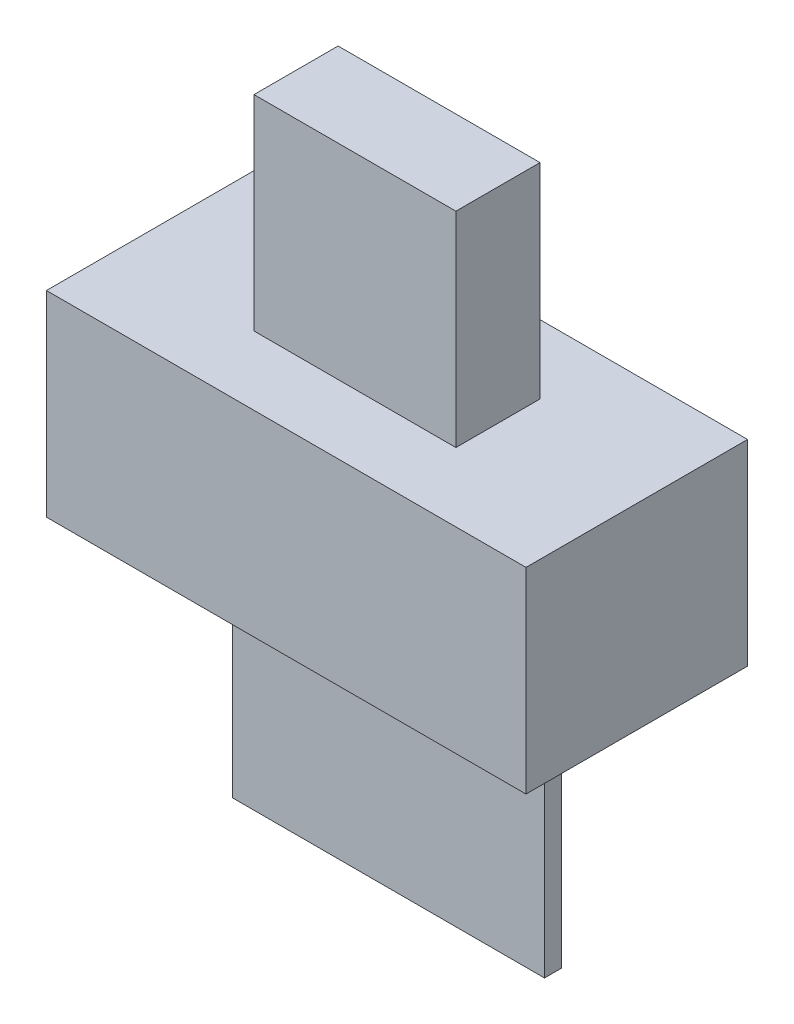
ISO-10303-21;
HEADER;
FILE_DESCRIPTION(('STEP AP214'),'2;1');
FILE_NAME('part.step','',(''),(''),'','','');
FILE_SCHEMA(('AUTOMOTIVE_DESIGN { 1 0 10303 214 1 1 1 1 }'));
ENDSEC;
DATA;
#1=APPLICATION_CONTEXT('core data for automotive mechanical design processes');
#2=APPLICATION_PROTOCOL_DEFINITION('international standard','automotive_design',2000,#1);
#3=PRODUCT_CONTEXT('',#1,'mechanical');
#4=PRODUCT('Part','Part','',(#3));
#5=PRODUCT_RELATED_PRODUCT_CATEGORY('part','',(#4));
#6=PRODUCT_DEFINITION_FORMATION('','',#4);
#7=PRODUCT_DEFINITION_CONTEXT('part definition',#1,'design');
#8=PRODUCT_DEFINITION('design','',#6,#7);
#9=PRODUCT_DEFINITION_SHAPE('','',#8);
#10=(LENGTH_UNIT() NAMED_UNIT(*) SI_UNIT(.MILLI.,.METRE.));
#11=(NAMED_UNIT(*) PLANE_ANGLE_UNIT() SI_UNIT($,.RADIAN.));
#12=(NAMED_UNIT(*) SI_UNIT($,.STERADIAN.) SOLID_ANGLE_UNIT());
#13=UNCERTAINTY_MEASURE_WITH_UNIT(LENGTH_MEASURE(1.E-05),#10,'distance_accuracy_value','');
#14=(GEOMETRIC_REPRESENTATION_CONTEXT(3) GLOBAL_UNCERTAINTY_ASSIGNED_CONTEXT((#13)) GLOBAL_UNIT_ASSIGNED_CONTEXT((#10,
#11,#12)) REPRESENTATION_CONTEXT('',''));
#15=CARTESIAN_POINT('',(0.,0.,0.));
#16=DIRECTION('',(0.,0.,1.));
#17=DIRECTION('',(1.,0.,0.));
#18=AXIS2_PLACEMENT_3D('',#15,#16,#17);
#19=CARTESIAN_POINT('',(0.,0.,3.95));
#20=DIRECTION('',(0.,1.,0.));
#21=DIRECTION('',(0.,0.,1.));
#22=AXIS2_PLACEMENT_3D('',#19,#20,#21);
#23=PLANE('',#22);
#24=DIRECTION('',(1.,0.,0.));
#25=VECTOR('',#24,1.);
#26=CARTESIAN_POINT('',(0.,0.,0.));
#27=LINE('',#26,#25);
#28=CARTESIAN_POINT('',(0.,0.,0.));
#29=VERTEX_POINT('',#28);
#30=CARTESIAN_POINT('',(8.55,0.,0.));
#31=VERTEX_POINT('',#30);
#32=EDGE_CURVE('E195',#29,#31,#27,.T.);
#33=ORIENTED_EDGE('',*,*,#32,.T.);
#34=DIRECTION('',(0.,0.,-1.));
#35=VECTOR('',#34,1.);
#36=CARTESIAN_POINT('',(8.55,0.,3.95));
#37=LINE('',#36,#35);
#38=CARTESIAN_POINT('',(8.55,0.,3.95));
#39=VERTEX_POINT('',#38);
#40=EDGE_CURVE('E40',#39,#31,#37,.T.);
#41=ORIENTED_EDGE('',*,*,#40,.F.);
#42=DIRECTION('',(1.,0.,0.));
#43=VECTOR('',#42,1.);
#44=CARTESIAN_POINT('',(0.,0.,3.95));
#45=LINE('',#44,#43);
#46=CARTESIAN_POINT('',(0.,0.,3.95));
#47=VERTEX_POINT('',#46);
#48=EDGE_CURVE('E185',#47,#39,#45,.T.);
#49=ORIENTED_EDGE('',*,*,#48,.F.);
#50=DIRECTION('',(0.,0.,-1.));
#51=VECTOR('',#50,1.);
#52=CARTESIAN_POINT('',(0.,0.,3.95));
#53=LINE('',#52,#51);
#54=EDGE_CURVE('E11',#47,#29,#53,.T.);
#55=ORIENTED_EDGE('',*,*,#54,.T.);
#56=EDGE_LOOP('',(#33,#41,#49,#55));
#57=FACE_BOUND('',#56,.T.);
#58=DIRECTION('',(0.,0.,-1.));
#59=VECTOR('',#58,1.);
#60=CARTESIAN_POINT('',(1.495,0.,2.125));
#61=LINE('',#60,#59);
#62=CARTESIAN_POINT('',(1.495,0.,2.125));
#63=VERTEX_POINT('',#62);
#64=CARTESIAN_POINT('',(1.495,0.,1.825));
#65=VERTEX_POINT('',#64);
#66=EDGE_CURVE('E144',#63,#65,#61,.T.);
#67=ORIENTED_EDGE('',*,*,#66,.F.);
#68=DIRECTION('',(1.,0.,0.));
#69=VECTOR('',#68,1.);
#70=CARTESIAN_POINT('',(1.495,0.,2.125));
#71=LINE('',#70,#69);
#72=CARTESIAN_POINT('',(7.055,0.,2.125));
#73=VERTEX_POINT('',#72);
#74=EDGE_CURVE('E140',#63,#73,#71,.T.);
#75=ORIENTED_EDGE('',*,*,#74,.T.);
#76=DIRECTION('',(0.,0.,-1.));
#77=VECTOR('',#76,1.);
#78=CARTESIAN_POINT('',(7.055,0.,2.125));
#79=LINE('',#78,#77);
#80=CARTESIAN_POINT('',(7.055,0.,1.825));
#81=VERTEX_POINT('',#80);
#82=EDGE_CURVE('E47',#73,#81,#79,.T.);
#83=ORIENTED_EDGE('',*,*,#82,.T.);
#84=DIRECTION('',(1.,0.,0.));
#85=VECTOR('',#84,1.);
#86=CARTESIAN_POINT('',(1.495,0.,1.825));
#87=LINE('',#86,#85);
#88=EDGE_CURVE('E229',#65,#81,#87,.T.);
#89=ORIENTED_EDGE('',*,*,#88,.F.);
#90=EDGE_LOOP('',(#67,#75,#83,#89));
#91=FACE_BOUND('',#90,.T.);
#92=ADVANCED_FACE('F32',(#57,#91),#23,.F.);
#93=CARTESIAN_POINT('',(0.,3.5,3.95));
#94=DIRECTION('',(0.,-1.,0.));
#95=DIRECTION('',(0.,0.,-1.));
#96=AXIS2_PLACEMENT_3D('',#93,#94,#95);
#97=PLANE('',#96);
#98=DIRECTION('',(-1.,0.,0.));
#99=VECTOR('',#98,1.);
#100=CARTESIAN_POINT('',(0.,3.5,0.));
#101=LINE('',#100,#99);
#102=CARTESIAN_POINT('',(8.55,3.5,0.));
#103=VERTEX_POINT('',#102);
#104=CARTESIAN_POINT('',(0.,3.5,0.));
#105=VERTEX_POINT('',#104);
#106=EDGE_CURVE('E186',#103,#105,#101,.T.);
#107=ORIENTED_EDGE('',*,*,#106,.T.);
#108=DIRECTION('',(0.,0.,-1.));
#109=VECTOR('',#108,1.);
#110=CARTESIAN_POINT('',(0.,3.5,3.95));
#111=LINE('',#110,#109);
#112=CARTESIAN_POINT('',(0.,3.5,3.95));
#113=VERTEX_POINT('',#112);
#114=EDGE_CURVE('E192',#113,#105,#111,.T.);
#115=ORIENTED_EDGE('',*,*,#114,.F.);
#116=DIRECTION('',(-1.,0.,0.));
#117=VECTOR('',#116,1.);
#118=CARTESIAN_POINT('',(0.,3.5,3.95));
#119=LINE('',#118,#117);
#120=CARTESIAN_POINT('',(8.55,3.5,3.95));
#121=VERTEX_POINT('',#120);
#122=EDGE_CURVE('E190',#121,#113,#119,.T.);
#123=ORIENTED_EDGE('',*,*,#122,.F.);
#124=DIRECTION('',(0.,0.,-1.));
#125=VECTOR('',#124,1.);
#126=CARTESIAN_POINT('',(8.55,3.5,3.95));
#127=LINE('',#126,#125);
#128=EDGE_CURVE('E202',#121,#103,#127,.T.);
#129=ORIENTED_EDGE('',*,*,#128,.T.);
#130=EDGE_LOOP('',(#107,#115,#123,#129));
#131=FACE_BOUND('',#130,.T.);
#132=DIRECTION('',(0.,0.,-1.));
#133=VECTOR('',#132,1.);
#134=CARTESIAN_POINT('',(6.075,3.5,1.225));
#135=LINE('',#134,#133);
#136=CARTESIAN_POINT('',(6.075,3.5,2.725));
#137=VERTEX_POINT('',#136);
#138=CARTESIAN_POINT('',(6.075,3.5,1.225));
#139=VERTEX_POINT('',#138);
#140=EDGE_CURVE('E146',#137,#139,#135,.T.);
#141=ORIENTED_EDGE('',*,*,#140,.F.);
#142=DIRECTION('',(1.,0.,0.));
#143=VECTOR('',#142,1.);
#144=CARTESIAN_POINT('',(2.475,3.5,2.725));
#145=LINE('',#144,#143);
#146=CARTESIAN_POINT('',(2.475,3.5,2.725));
#147=VERTEX_POINT('',#146);
#148=EDGE_CURVE('E158',#147,#137,#145,.T.);
#149=ORIENTED_EDGE('',*,*,#148,.F.);
#150=DIRECTION('',(0.,0.,1.));
#151=VECTOR('',#150,1.);
#152=CARTESIAN_POINT('',(2.475,3.5,1.225));
#153=LINE('',#152,#151);
#154=CARTESIAN_POINT('',(2.475,3.5,1.225));
#155=VERTEX_POINT('',#154);
#156=EDGE_CURVE('E166',#155,#147,#153,.T.);
#157=ORIENTED_EDGE('',*,*,#156,.F.);
#158=DIRECTION('',(-1.,0.,0.));
#159=VECTOR('',#158,1.);
#160=CARTESIAN_POINT('',(2.475,3.5,1.225));
#161=LINE('',#160,#159);
#162=EDGE_CURVE('E55',#139,#155,#161,.T.);
#163=ORIENTED_EDGE('',*,*,#162,.F.);
#164=EDGE_LOOP('',(#141,#149,#157,#163));
#165=FACE_BOUND('',#164,.T.);
#166=ADVANCED_FACE('F218',(#131,#165),#97,.F.);
#167=CARTESIAN_POINT('',(0.,0.,3.95));
#168=DIRECTION('',(1.,0.,0.));
#169=DIRECTION('',(0.,0.,-1.));
#170=AXIS2_PLACEMENT_3D('',#167,#168,#169);
#171=PLANE('',#170);
#172=DIRECTION('',(0.,-1.,0.));
#173=VECTOR('',#172,1.);
#174=CARTESIAN_POINT('',(0.,0.,0.));
#175=LINE('',#174,#173);
#176=EDGE_CURVE('E181',#105,#29,#175,.T.);
#177=ORIENTED_EDGE('',*,*,#176,.T.);
#178=ORIENTED_EDGE('',*,*,#54,.F.);
#179=DIRECTION('',(0.,-1.,0.));
#180=VECTOR('',#179,1.);
#181=CARTESIAN_POINT('',(0.,0.,3.95));
#182=LINE('',#181,#180);
#183=EDGE_CURVE('E182',#113,#47,#182,.T.);
#184=ORIENTED_EDGE('',*,*,#183,.F.);
#185=ORIENTED_EDGE('',*,*,#114,.T.);
#186=EDGE_LOOP('',(#177,#178,#184,#185));
#187=FACE_BOUND('',#186,.T.);
#188=ADVANCED_FACE('F34',(#187),#171,.F.);
#189=CARTESIAN_POINT('',(8.55,0.,3.95));
#190=DIRECTION('',(-1.,0.,0.));
#191=DIRECTION('',(0.,0.,1.));
#192=AXIS2_PLACEMENT_3D('',#189,#190,#191);
#193=PLANE('',#192);
#194=DIRECTION('',(0.,1.,0.));
#195=VECTOR('',#194,1.);
#196=CARTESIAN_POINT('',(8.55,0.,0.));
#197=LINE('',#196,#195);
#198=EDGE_CURVE('E197',#31,#103,#197,.T.);
#199=ORIENTED_EDGE('',*,*,#198,.T.);
#200=ORIENTED_EDGE('',*,*,#128,.F.);
#201=DIRECTION('',(0.,1.,0.));
#202=VECTOR('',#201,1.);
#203=CARTESIAN_POINT('',(8.55,0.,3.95));
#204=LINE('',#203,#202);
#205=EDGE_CURVE('E188',#39,#121,#204,.T.);
#206=ORIENTED_EDGE('',*,*,#205,.F.);
#207=ORIENTED_EDGE('',*,*,#40,.T.);
#208=EDGE_LOOP('',(#199,#200,#206,#207));
#209=FACE_BOUND('',#208,.T.);
#210=ADVANCED_FACE('F209',(#209),#193,.F.);
#211=CARTESIAN_POINT('',(0.,0.,3.95));
#212=DIRECTION('',(0.,0.,-1.));
#213=DIRECTION('',(-1.,0.,0.));
#214=AXIS2_PLACEMENT_3D('',#211,#212,#213);
#215=PLANE('',#214);
#216=ORIENTED_EDGE('',*,*,#183,.T.);
#217=ORIENTED_EDGE('',*,*,#48,.T.);
#218=ORIENTED_EDGE('',*,*,#205,.T.);
#219=ORIENTED_EDGE('',*,*,#122,.T.);
#220=EDGE_LOOP('',(#216,#217,#218,#219));
#221=FACE_BOUND('',#220,.T.);
#222=ADVANCED_FACE('F224',(#221),#215,.F.);
#223=CARTESIAN_POINT('',(0.,0.,0.));
#224=DIRECTION('',(0.,0.,-1.));
#225=DIRECTION('',(-1.,0.,0.));
#226=AXIS2_PLACEMENT_3D('',#223,#224,#225);
#227=PLANE('',#226);
#228=ORIENTED_EDGE('',*,*,#176,.F.);
#229=ORIENTED_EDGE('',*,*,#106,.F.);
#230=ORIENTED_EDGE('',*,*,#198,.F.);
#231=ORIENTED_EDGE('',*,*,#32,.F.);
#232=EDGE_LOOP('',(#228,#229,#230,#231));
#233=FACE_BOUND('',#232,.T.);
#234=ADVANCED_FACE('F215',(#233),#227,.T.);
#235=CARTESIAN_POINT('',(6.075,7.15,1.225));
#236=DIRECTION('',(-1.,0.,0.));
#237=DIRECTION('',(0.,0.,1.));
#238=AXIS2_PLACEMENT_3D('',#235,#236,#237);
#239=PLANE('',#238);
#240=ORIENTED_EDGE('',*,*,#140,.T.);
#241=DIRECTION('',(0.,-1.,0.));
#242=VECTOR('',#241,1.);
#243=CARTESIAN_POINT('',(6.075,7.15,1.225));
#244=LINE('',#243,#242);
#245=CARTESIAN_POINT('',(6.075,7.15,1.225));
#246=VERTEX_POINT('',#245);
#247=EDGE_CURVE('E179',#246,#139,#244,.T.);
#248=ORIENTED_EDGE('',*,*,#247,.F.);
#249=DIRECTION('',(0.,0.,-1.));
#250=VECTOR('',#249,1.);
#251=CARTESIAN_POINT('',(6.075,7.15,1.225));
#252=LINE('',#251,#250);
#253=CARTESIAN_POINT('',(6.075,7.15,2.725));
#254=VERTEX_POINT('',#253);
#255=EDGE_CURVE('E154',#254,#246,#252,.T.);
#256=ORIENTED_EDGE('',*,*,#255,.F.);
#257=DIRECTION('',(0.,-1.,0.));
#258=VECTOR('',#257,1.);
#259=CARTESIAN_POINT('',(6.075,7.15,2.725));
#260=LINE('',#259,#258);
#261=EDGE_CURVE('E163',#254,#137,#260,.T.);
#262=ORIENTED_EDGE('',*,*,#261,.T.);
#263=EDGE_LOOP('',(#240,#248,#256,#262));
#264=FACE_BOUND('',#263,.T.);
#265=ADVANCED_FACE('F268',(#264),#239,.F.);
#266=CARTESIAN_POINT('',(2.475,7.15,1.225));
#267=DIRECTION('',(0.,0.,1.));
#268=DIRECTION('',(1.,0.,0.));
#269=AXIS2_PLACEMENT_3D('',#266,#267,#268);
#270=PLANE('',#269);
#271=ORIENTED_EDGE('',*,*,#162,.T.);
#272=DIRECTION('',(0.,-1.,0.));
#273=VECTOR('',#272,1.);
#274=CARTESIAN_POINT('',(2.475,7.15,1.225));
#275=LINE('',#274,#273);
#276=CARTESIAN_POINT('',(2.475,7.15,1.225));
#277=VERTEX_POINT('',#276);
#278=EDGE_CURVE('E176',#277,#155,#275,.T.);
#279=ORIENTED_EDGE('',*,*,#278,.F.);
#280=DIRECTION('',(-1.,0.,0.));
#281=VECTOR('',#280,1.);
#282=CARTESIAN_POINT('',(2.475,7.15,1.225));
#283=LINE('',#282,#281);
#284=EDGE_CURVE('E157',#246,#277,#283,.T.);
#285=ORIENTED_EDGE('',*,*,#284,.F.);
#286=ORIENTED_EDGE('',*,*,#247,.T.);
#287=EDGE_LOOP('',(#271,#279,#285,#286));
#288=FACE_BOUND('',#287,.T.);
#289=ADVANCED_FACE('F264',(#288),#270,.F.);
#290=CARTESIAN_POINT('',(2.475,7.15,1.225));
#291=DIRECTION('',(1.,0.,0.));
#292=DIRECTION('',(0.,0.,-1.));
#293=AXIS2_PLACEMENT_3D('',#290,#291,#292);
#294=PLANE('',#293);
#295=ORIENTED_EDGE('',*,*,#156,.T.);
#296=DIRECTION('',(0.,-1.,0.));
#297=VECTOR('',#296,1.);
#298=CARTESIAN_POINT('',(2.475,7.15,2.725));
#299=LINE('',#298,#297);
#300=CARTESIAN_POINT('',(2.475,7.15,2.725));
#301=VERTEX_POINT('',#300);
#302=EDGE_CURVE('E173',#301,#147,#299,.T.);
#303=ORIENTED_EDGE('',*,*,#302,.F.);
#304=DIRECTION('',(0.,0.,1.));
#305=VECTOR('',#304,1.);
#306=CARTESIAN_POINT('',(2.475,7.15,1.225));
#307=LINE('',#306,#305);
#308=EDGE_CURVE('E160',#277,#301,#307,.T.);
#309=ORIENTED_EDGE('',*,*,#308,.F.);
#310=ORIENTED_EDGE('',*,*,#278,.T.);
#311=EDGE_LOOP('',(#295,#303,#309,#310));
#312=FACE_BOUND('',#311,.T.);
#313=ADVANCED_FACE('F260',(#312),#294,.F.);
#314=CARTESIAN_POINT('',(2.475,7.15,2.725));
#315=DIRECTION('',(0.,0.,-1.));
#316=DIRECTION('',(-1.,0.,0.));
#317=AXIS2_PLACEMENT_3D('',#314,#315,#316);
#318=PLANE('',#317);
#319=ORIENTED_EDGE('',*,*,#148,.T.);
#320=ORIENTED_EDGE('',*,*,#261,.F.);
#321=DIRECTION('',(1.,0.,0.));
#322=VECTOR('',#321,1.);
#323=CARTESIAN_POINT('',(2.475,7.15,2.725));
#324=LINE('',#323,#322);
#325=EDGE_CURVE('E162',#301,#254,#324,.T.);
#326=ORIENTED_EDGE('',*,*,#325,.F.);
#327=ORIENTED_EDGE('',*,*,#302,.T.);
#328=EDGE_LOOP('',(#319,#320,#326,#327));
#329=FACE_BOUND('',#328,.T.);
#330=ADVANCED_FACE('F256',(#329),#318,.F.);
#331=CARTESIAN_POINT('',(0.,7.15,0.));
#332=DIRECTION('',(0.,1.,0.));
#333=DIRECTION('',(0.,0.,1.));
#334=AXIS2_PLACEMENT_3D('',#331,#332,#333);
#335=PLANE('',#334);
#336=ORIENTED_EDGE('',*,*,#255,.T.);
#337=ORIENTED_EDGE('',*,*,#284,.T.);
#338=ORIENTED_EDGE('',*,*,#308,.T.);
#339=ORIENTED_EDGE('',*,*,#325,.T.);
#340=EDGE_LOOP('',(#336,#337,#338,#339));
#341=FACE_BOUND('',#340,.T.);
#342=ADVANCED_FACE('F253',(#341),#335,.T.);
#343=CARTESIAN_POINT('',(1.495,-4.5,2.125));
#344=DIRECTION('',(1.,0.,0.));
#345=DIRECTION('',(0.,0.,-1.));
#346=AXIS2_PLACEMENT_3D('',#343,#344,#345);
#347=PLANE('',#346);
#348=ORIENTED_EDGE('',*,*,#66,.T.);
#349=DIRECTION('',(0.,1.,0.));
#350=VECTOR('',#349,1.);
#351=CARTESIAN_POINT('',(1.495,-4.5,1.825));
#352=LINE('',#351,#350);
#353=CARTESIAN_POINT('',(1.495,-4.5,1.825));
#354=VERTEX_POINT('',#353);
#355=EDGE_CURVE('E125',#354,#65,#352,.T.);
#356=ORIENTED_EDGE('',*,*,#355,.F.);
#357=DIRECTION('',(0.,0.,-1.));
#358=VECTOR('',#357,1.);
#359=CARTESIAN_POINT('',(1.495,-4.5,2.125));
#360=LINE('',#359,#358);
#361=CARTESIAN_POINT('',(1.495,-4.5,2.125));
#362=VERTEX_POINT('',#361);
#363=EDGE_CURVE('E132',#362,#354,#360,.T.);
#364=ORIENTED_EDGE('',*,*,#363,.F.);
#365=DIRECTION('',(0.,1.,0.));
#366=VECTOR('',#365,1.);
#367=CARTESIAN_POINT('',(1.495,-4.5,2.125));
#368=LINE('',#367,#366);
#369=EDGE_CURVE('E237',#362,#63,#368,.T.);
#370=ORIENTED_EDGE('',*,*,#369,.T.);
#371=EDGE_LOOP('',(#348,#356,#364,#370));
#372=FACE_BOUND('',#371,.T.);
#373=ADVANCED_FACE('F142',(#372),#347,.F.);
#374=CARTESIAN_POINT('',(1.495,-4.5,1.825));
#375=DIRECTION('',(0.,0.,1.));
#376=DIRECTION('',(1.,0.,0.));
#377=AXIS2_PLACEMENT_3D('',#374,#375,#376);
#378=PLANE('',#377);
#379=ORIENTED_EDGE('',*,*,#88,.T.);
#380=DIRECTION('',(0.,1.,0.));
#381=VECTOR('',#380,1.);
#382=CARTESIAN_POINT('',(7.055,-4.5,1.825));
#383=LINE('',#382,#381);
#384=CARTESIAN_POINT('',(7.055,-4.5,1.825));
#385=VERTEX_POINT('',#384);
#386=EDGE_CURVE('E127',#385,#81,#383,.T.);
#387=ORIENTED_EDGE('',*,*,#386,.F.);
#388=DIRECTION('',(1.,0.,0.));
#389=VECTOR('',#388,1.);
#390=CARTESIAN_POINT('',(1.495,-4.5,1.825));
#391=LINE('',#390,#389);
#392=EDGE_CURVE('E120',#354,#385,#391,.T.);
#393=ORIENTED_EDGE('',*,*,#392,.F.);
#394=ORIENTED_EDGE('',*,*,#355,.T.);
#395=EDGE_LOOP('',(#379,#387,#393,#394));
#396=FACE_BOUND('',#395,.T.);
#397=ADVANCED_FACE('F123',(#396),#378,.F.);
#398=CARTESIAN_POINT('',(7.055,-4.5,2.125));
#399=DIRECTION('',(1.,0.,0.));
#400=DIRECTION('',(0.,0.,-1.));
#401=AXIS2_PLACEMENT_3D('',#398,#399,#400);
#402=PLANE('',#401);
#403=ORIENTED_EDGE('',*,*,#82,.F.);
#404=DIRECTION('',(0.,1.,0.));
#405=VECTOR('',#404,1.);
#406=CARTESIAN_POINT('',(7.055,-4.5,2.125));
#407=LINE('',#406,#405);
#408=CARTESIAN_POINT('',(7.055,-4.5,2.125));
#409=VERTEX_POINT('',#408);
#410=EDGE_CURVE('E150',#409,#73,#407,.T.);
#411=ORIENTED_EDGE('',*,*,#410,.F.);
#412=DIRECTION('',(0.,0.,-1.));
#413=VECTOR('',#412,1.);
#414=CARTESIAN_POINT('',(7.055,-4.5,2.125));
#415=LINE('',#414,#413);
#416=EDGE_CURVE('E131',#409,#385,#415,.T.);
#417=ORIENTED_EDGE('',*,*,#416,.T.);
#418=ORIENTED_EDGE('',*,*,#386,.T.);
#419=EDGE_LOOP('',(#403,#411,#417,#418));
#420=FACE_BOUND('',#419,.T.);
#421=ADVANCED_FACE('F240',(#420),#402,.T.);
#422=CARTESIAN_POINT('',(1.495,-4.5,2.125));
#423=DIRECTION('',(0.,0.,1.));
#424=DIRECTION('',(1.,0.,0.));
#425=AXIS2_PLACEMENT_3D('',#422,#423,#424);
#426=PLANE('',#425);
#427=ORIENTED_EDGE('',*,*,#74,.F.);
#428=ORIENTED_EDGE('',*,*,#369,.F.);
#429=DIRECTION('',(1.,0.,0.));
#430=VECTOR('',#429,1.);
#431=CARTESIAN_POINT('',(1.495,-4.5,2.125));
#432=LINE('',#431,#430);
#433=EDGE_CURVE('E138',#362,#409,#432,.T.);
#434=ORIENTED_EDGE('',*,*,#433,.T.);
#435=ORIENTED_EDGE('',*,*,#410,.T.);
#436=EDGE_LOOP('',(#427,#428,#434,#435));
#437=FACE_BOUND('',#436,.T.);
#438=ADVANCED_FACE('F239',(#437),#426,.T.);
#439=CARTESIAN_POINT('',(0.,-4.5,0.));
#440=DIRECTION('',(0.,-1.,0.));
#441=DIRECTION('',(0.,0.,-1.));
#442=AXIS2_PLACEMENT_3D('',#439,#440,#441);
#443=PLANE('',#442);
#444=ORIENTED_EDGE('',*,*,#363,.T.);
#445=ORIENTED_EDGE('',*,*,#392,.T.);
#446=ORIENTED_EDGE('',*,*,#416,.F.);
#447=ORIENTED_EDGE('',*,*,#433,.F.);
#448=EDGE_LOOP('',(#444,#445,#446,#447));
#449=FACE_BOUND('',#448,.T.);
#450=ADVANCED_FACE('F136',(#449),#443,.T.);
#451=CLOSED_SHELL('',(#92,#166,#188,#210,#222,#234,#265,#289,#313,#330,#342,#373,#397,#421,#438,#450));
#452=MANIFOLD_SOLID_BREP('B2',#451);
#453=ADVANCED_BREP_SHAPE_REPRESENTATION('',(#18,#452),#14);
#454=SHAPE_DEFINITION_REPRESENTATION(#9,#453);
ENDSEC;
END-ISO-10303-21;
